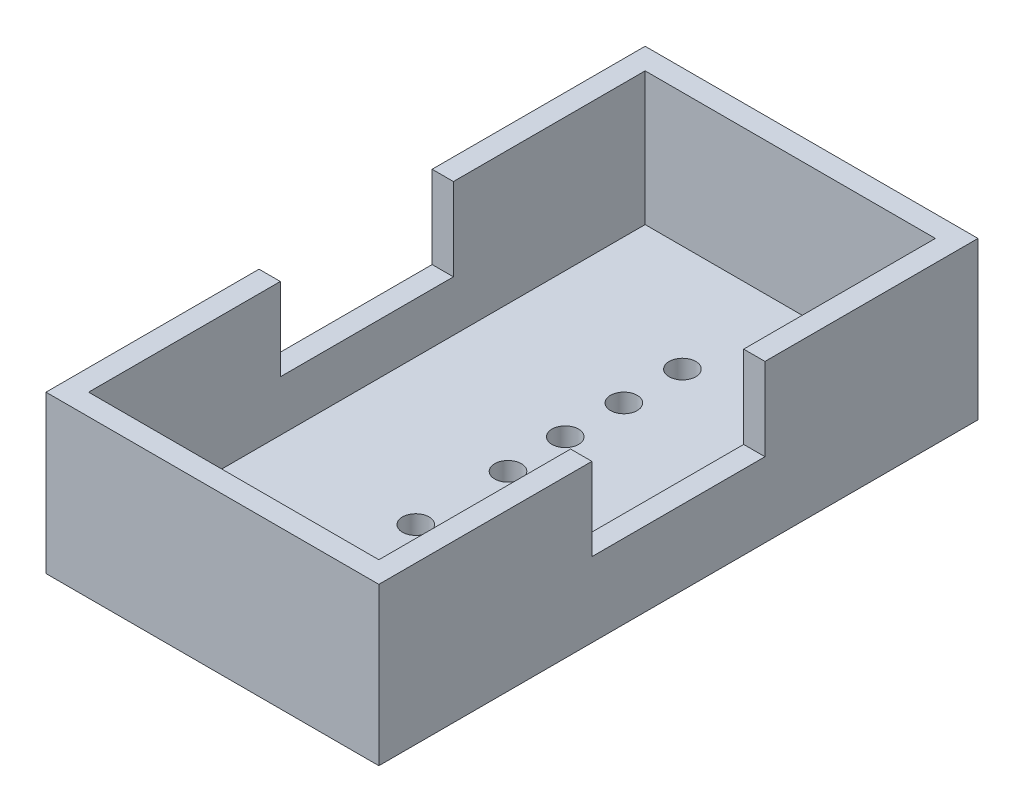
ISO-10303-21;
HEADER;
FILE_DESCRIPTION(('STEP AP214'),'2;1');
FILE_NAME('part.step','',(''),(''),'','','');
FILE_SCHEMA(('AUTOMOTIVE_DESIGN { 1 0 10303 214 1 1 1 1 }'));
ENDSEC;
DATA;
#1=APPLICATION_CONTEXT('core data for automotive mechanical design processes');
#2=APPLICATION_PROTOCOL_DEFINITION('international standard','automotive_design',2000,#1);
#3=PRODUCT_CONTEXT('',#1,'mechanical');
#4=PRODUCT('Part','Part','',(#3));
#5=PRODUCT_RELATED_PRODUCT_CATEGORY('part','',(#4));
#6=PRODUCT_DEFINITION_FORMATION('','',#4);
#7=PRODUCT_DEFINITION_CONTEXT('part definition',#1,'design');
#8=PRODUCT_DEFINITION('design','',#6,#7);
#9=PRODUCT_DEFINITION_SHAPE('','',#8);
#10=(LENGTH_UNIT() NAMED_UNIT(*) SI_UNIT(.MILLI.,.METRE.));
#11=(NAMED_UNIT(*) PLANE_ANGLE_UNIT() SI_UNIT($,.RADIAN.));
#12=(NAMED_UNIT(*) SI_UNIT($,.STERADIAN.) SOLID_ANGLE_UNIT());
#13=UNCERTAINTY_MEASURE_WITH_UNIT(LENGTH_MEASURE(1.E-05),#10,'distance_accuracy_value','');
#14=(GEOMETRIC_REPRESENTATION_CONTEXT(3) GLOBAL_UNCERTAINTY_ASSIGNED_CONTEXT((#13)) GLOBAL_UNIT_ASSIGNED_CONTEXT((#10,
#11,#12)) REPRESENTATION_CONTEXT('',''));
#15=CARTESIAN_POINT('',(0.,0.,0.));
#16=DIRECTION('',(0.,0.,1.));
#17=DIRECTION('',(1.,0.,0.));
#18=AXIS2_PLACEMENT_3D('',#15,#16,#17);
#19=CARTESIAN_POINT('',(0.,14.986,0.));
#20=DIRECTION('',(0.,-1.,0.));
#21=DIRECTION('',(0.,0.,-1.));
#22=AXIS2_PLACEMENT_3D('',#19,#20,#21);
#23=PLANE('',#22);
#24=DIRECTION('',(0.,0.,-1.));
#25=VECTOR('',#24,1.);
#26=CARTESIAN_POINT('',(15.875,14.986,-28.575));
#27=LINE('',#26,#25);
#28=CARTESIAN_POINT('',(15.875,14.986,28.575));
#29=VERTEX_POINT('',#28);
#30=CARTESIAN_POINT('',(15.875,14.986,8.25499999999999));
#31=VERTEX_POINT('',#30);
#32=EDGE_CURVE('E174',#29,#31,#27,.T.);
#33=ORIENTED_EDGE('',*,*,#32,.T.);
#34=DIRECTION('',(-1.,0.,0.));
#35=VECTOR('',#34,1.);
#36=CARTESIAN_POINT('',(15.875,14.986,8.25499999999999));
#37=LINE('',#36,#35);
#38=CARTESIAN_POINT('',(13.843,14.986,8.25499999999999));
#39=VERTEX_POINT('',#38);
#40=EDGE_CURVE('E156',#31,#39,#37,.T.);
#41=ORIENTED_EDGE('',*,*,#40,.T.);
#42=DIRECTION('',(0.,0.,-1.));
#43=VECTOR('',#42,1.);
#44=CARTESIAN_POINT('',(13.843,14.986,26.543));
#45=LINE('',#44,#43);
#46=CARTESIAN_POINT('',(13.843,14.986,26.543));
#47=VERTEX_POINT('',#46);
#48=EDGE_CURVE('E241',#47,#39,#45,.T.);
#49=ORIENTED_EDGE('',*,*,#48,.F.);
#50=DIRECTION('',(1.,0.,0.));
#51=VECTOR('',#50,1.);
#52=CARTESIAN_POINT('',(-13.843,14.986,26.543));
#53=LINE('',#52,#51);
#54=CARTESIAN_POINT('',(-13.843,14.986,26.543));
#55=VERTEX_POINT('',#54);
#56=EDGE_CURVE('E256',#55,#47,#53,.T.);
#57=ORIENTED_EDGE('',*,*,#56,.F.);
#58=DIRECTION('',(0.,0.,1.));
#59=VECTOR('',#58,1.);
#60=CARTESIAN_POINT('',(-13.843,14.986,-26.543));
#61=LINE('',#60,#59);
#62=CARTESIAN_POINT('',(-13.843,14.986,8.255));
#63=VERTEX_POINT('',#62);
#64=EDGE_CURVE('E371',#63,#55,#61,.T.);
#65=ORIENTED_EDGE('',*,*,#64,.F.);
#66=CARTESIAN_POINT('',(-15.875,14.986,8.255));
#67=VERTEX_POINT('',#66);
#68=EDGE_CURVE('E169',#63,#67,#37,.T.);
#69=ORIENTED_EDGE('',*,*,#68,.T.);
#70=DIRECTION('',(0.,0.,1.));
#71=VECTOR('',#70,1.);
#72=CARTESIAN_POINT('',(-15.875,14.986,28.575));
#73=LINE('',#72,#71);
#74=CARTESIAN_POINT('',(-15.875,14.986,28.575));
#75=VERTEX_POINT('',#74);
#76=EDGE_CURVE('E283',#67,#75,#73,.T.);
#77=ORIENTED_EDGE('',*,*,#76,.T.);
#78=DIRECTION('',(1.,0.,0.));
#79=VECTOR('',#78,1.);
#80=CARTESIAN_POINT('',(15.875,14.986,28.575));
#81=LINE('',#80,#79);
#82=EDGE_CURVE('E184',#75,#29,#81,.T.);
#83=ORIENTED_EDGE('',*,*,#82,.T.);
#84=EDGE_LOOP('',(#33,#41,#49,#57,#65,#69,#77,#83));
#85=FACE_BOUND('',#84,.T.);
#86=ADVANCED_FACE('F43',(#85),#23,.F.);
#87=CARTESIAN_POINT('',(15.875,2.286,-28.575));
#88=DIRECTION('',(-1.,0.,0.));
#89=DIRECTION('',(0.,0.,1.));
#90=AXIS2_PLACEMENT_3D('',#87,#88,#89);
#91=PLANE('',#90);
#92=DIRECTION('',(0.,0.,1.));
#93=VECTOR('',#92,1.);
#94=CARTESIAN_POINT('',(15.875,7.112,-8.25500000000001));
#95=LINE('',#94,#93);
#96=CARTESIAN_POINT('',(15.875,7.112,-8.25500000000001));
#97=VERTEX_POINT('',#96);
#98=CARTESIAN_POINT('',(15.875,7.112,8.255));
#99=VERTEX_POINT('',#98);
#100=EDGE_CURVE('E177',#97,#99,#95,.T.);
#101=ORIENTED_EDGE('',*,*,#100,.T.);
#102=DIRECTION('',(0.,1.,0.));
#103=VECTOR('',#102,1.);
#104=CARTESIAN_POINT('',(15.875,14.986,8.25499999999999));
#105=LINE('',#104,#103);
#106=EDGE_CURVE('E160',#99,#31,#105,.T.);
#107=ORIENTED_EDGE('',*,*,#106,.T.);
#108=ORIENTED_EDGE('',*,*,#32,.F.);
#109=DIRECTION('',(0.,-1.,0.));
#110=VECTOR('',#109,1.);
#111=CARTESIAN_POINT('',(15.875,2.286,28.575));
#112=LINE('',#111,#110);
#113=CARTESIAN_POINT('',(15.875,0.,28.575));
#114=VERTEX_POINT('',#113);
#115=EDGE_CURVE('E210',#29,#114,#112,.T.);
#116=ORIENTED_EDGE('',*,*,#115,.T.);
#117=DIRECTION('',(0.,0.,-1.));
#118=VECTOR('',#117,1.);
#119=CARTESIAN_POINT('',(15.875,0.,-28.575));
#120=LINE('',#119,#118);
#121=CARTESIAN_POINT('',(15.875,0.,-28.575));
#122=VERTEX_POINT('',#121);
#123=EDGE_CURVE('E193',#114,#122,#120,.T.);
#124=ORIENTED_EDGE('',*,*,#123,.T.);
#125=DIRECTION('',(0.,-1.,0.));
#126=VECTOR('',#125,1.);
#127=CARTESIAN_POINT('',(15.875,2.286,-28.575));
#128=LINE('',#127,#126);
#129=CARTESIAN_POINT('',(15.875,14.986,-28.575));
#130=VERTEX_POINT('',#129);
#131=EDGE_CURVE('E221',#130,#122,#128,.T.);
#132=ORIENTED_EDGE('',*,*,#131,.F.);
#133=CARTESIAN_POINT('',(15.875,14.986,-8.25500000000001));
#134=VERTEX_POINT('',#133);
#135=EDGE_CURVE('E187',#134,#130,#27,.T.);
#136=ORIENTED_EDGE('',*,*,#135,.F.);
#137=DIRECTION('',(0.,-1.,0.));
#138=VECTOR('',#137,1.);
#139=CARTESIAN_POINT('',(15.875,14.986,-8.25500000000001));
#140=LINE('',#139,#138);
#141=EDGE_CURVE('E179',#134,#97,#140,.T.);
#142=ORIENTED_EDGE('',*,*,#141,.T.);
#143=EDGE_LOOP('',(#101,#107,#108,#116,#124,#132,#136,#142));
#144=FACE_BOUND('',#143,.T.);
#145=ADVANCED_FACE('F45',(#144),#91,.F.);
#146=CARTESIAN_POINT('',(-15.875,2.286,-28.575));
#147=DIRECTION('',(0.,0.,1.));
#148=DIRECTION('',(1.,0.,0.));
#149=AXIS2_PLACEMENT_3D('',#146,#147,#148);
#150=PLANE('',#149);
#151=DIRECTION('',(-1.,0.,0.));
#152=VECTOR('',#151,1.);
#153=CARTESIAN_POINT('',(-15.875,0.,-28.575));
#154=LINE('',#153,#152);
#155=CARTESIAN_POINT('',(-15.875,0.,-28.575));
#156=VERTEX_POINT('',#155);
#157=EDGE_CURVE('E201',#122,#156,#154,.T.);
#158=ORIENTED_EDGE('',*,*,#157,.T.);
#159=DIRECTION('',(0.,-1.,0.));
#160=VECTOR('',#159,1.);
#161=CARTESIAN_POINT('',(-15.875,2.286,-28.575));
#162=LINE('',#161,#160);
#163=CARTESIAN_POINT('',(-15.875,14.986,-28.575));
#164=VERTEX_POINT('',#163);
#165=EDGE_CURVE('E217',#164,#156,#162,.T.);
#166=ORIENTED_EDGE('',*,*,#165,.F.);
#167=DIRECTION('',(-1.,0.,0.));
#168=VECTOR('',#167,1.);
#169=CARTESIAN_POINT('',(-15.875,14.986,-28.575));
#170=LINE('',#169,#168);
#171=EDGE_CURVE('E186',#130,#164,#170,.T.);
#172=ORIENTED_EDGE('',*,*,#171,.F.);
#173=ORIENTED_EDGE('',*,*,#131,.T.);
#174=EDGE_LOOP('',(#158,#166,#172,#173));
#175=FACE_BOUND('',#174,.T.);
#176=ADVANCED_FACE('F311',(#175),#150,.F.);
#177=CARTESIAN_POINT('',(-15.875,2.286,-28.575));
#178=DIRECTION('',(1.,0.,0.));
#179=DIRECTION('',(0.,0.,-1.));
#180=AXIS2_PLACEMENT_3D('',#177,#178,#179);
#181=PLANE('',#180);
#182=ORIENTED_EDGE('',*,*,#76,.F.);
#183=DIRECTION('',(0.,1.,0.));
#184=VECTOR('',#183,1.);
#185=CARTESIAN_POINT('',(-15.875,14.986,8.255));
#186=LINE('',#185,#184);
#187=CARTESIAN_POINT('',(-15.875,7.112,8.255));
#188=VERTEX_POINT('',#187);
#189=EDGE_CURVE('E403',#188,#67,#186,.T.);
#190=ORIENTED_EDGE('',*,*,#189,.F.);
#191=DIRECTION('',(0.,0.,1.));
#192=VECTOR('',#191,1.);
#193=CARTESIAN_POINT('',(-15.875,7.112,-8.255));
#194=LINE('',#193,#192);
#195=CARTESIAN_POINT('',(-15.875,7.112,-8.255));
#196=VERTEX_POINT('',#195);
#197=EDGE_CURVE('E180',#196,#188,#194,.T.);
#198=ORIENTED_EDGE('',*,*,#197,.F.);
#199=DIRECTION('',(0.,-1.,0.));
#200=VECTOR('',#199,1.);
#201=CARTESIAN_POINT('',(-15.875,14.986,-8.255));
#202=LINE('',#201,#200);
#203=CARTESIAN_POINT('',(-15.875,14.986,-8.255));
#204=VERTEX_POINT('',#203);
#205=EDGE_CURVE('E399',#204,#196,#202,.T.);
#206=ORIENTED_EDGE('',*,*,#205,.F.);
#207=EDGE_CURVE('E284',#164,#204,#73,.T.);
#208=ORIENTED_EDGE('',*,*,#207,.F.);
#209=ORIENTED_EDGE('',*,*,#165,.T.);
#210=DIRECTION('',(0.,0.,1.));
#211=VECTOR('',#210,1.);
#212=CARTESIAN_POINT('',(-15.875,0.,-28.575));
#213=LINE('',#212,#211);
#214=CARTESIAN_POINT('',(-15.875,0.,28.575));
#215=VERTEX_POINT('',#214);
#216=EDGE_CURVE('E204',#156,#215,#213,.T.);
#217=ORIENTED_EDGE('',*,*,#216,.T.);
#218=DIRECTION('',(0.,-1.,0.));
#219=VECTOR('',#218,1.);
#220=CARTESIAN_POINT('',(-15.875,2.286,28.575));
#221=LINE('',#220,#219);
#222=EDGE_CURVE('E213',#75,#215,#221,.T.);
#223=ORIENTED_EDGE('',*,*,#222,.F.);
#224=EDGE_LOOP('',(#182,#190,#198,#206,#208,#209,#217,#223));
#225=FACE_BOUND('',#224,.T.);
#226=ADVANCED_FACE('F300',(#225),#181,.F.);
#227=CARTESIAN_POINT('',(-15.875,2.286,28.575));
#228=DIRECTION('',(0.,0.,-1.));
#229=DIRECTION('',(-1.,0.,0.));
#230=AXIS2_PLACEMENT_3D('',#227,#228,#229);
#231=PLANE('',#230);
#232=DIRECTION('',(1.,0.,0.));
#233=VECTOR('',#232,1.);
#234=CARTESIAN_POINT('',(-15.875,0.,28.575));
#235=LINE('',#234,#233);
#236=EDGE_CURVE('E207',#215,#114,#235,.T.);
#237=ORIENTED_EDGE('',*,*,#236,.T.);
#238=ORIENTED_EDGE('',*,*,#115,.F.);
#239=ORIENTED_EDGE('',*,*,#82,.F.);
#240=ORIENTED_EDGE('',*,*,#222,.T.);
#241=EDGE_LOOP('',(#237,#238,#239,#240));
#242=FACE_BOUND('',#241,.T.);
#243=ADVANCED_FACE('F304',(#242),#231,.F.);
#244=CARTESIAN_POINT('',(0.,0.,0.));
#245=DIRECTION('',(0.,1.,0.));
#246=DIRECTION('',(0.,0.,1.));
#247=AXIS2_PLACEMENT_3D('',#244,#245,#246);
#248=PLANE('',#247);
#249=CARTESIAN_POINT('',(-0.127,0.,-16.383));
#250=DIRECTION('',(0.,1.,0.));
#251=DIRECTION('',(0.,0.,1.));
#252=AXIS2_PLACEMENT_3D('',#249,#250,#251);
#253=CIRCLE('',#252,1.27);
#254=CARTESIAN_POINT('',(-0.127,0.,-15.113));
#255=VERTEX_POINT('',#254);
#256=EDGE_CURVE('E264',#255,#255,#253,.T.);
#257=ORIENTED_EDGE('',*,*,#256,.T.);
#258=EDGE_LOOP('',(#257));
#259=FACE_BOUND('',#258,.T.);
#260=CARTESIAN_POINT('',(-0.127,0.,-10.795));
#261=DIRECTION('',(0.,1.,0.));
#262=DIRECTION('',(0.,0.,1.));
#263=AXIS2_PLACEMENT_3D('',#260,#261,#262);
#264=CIRCLE('',#263,1.27);
#265=CARTESIAN_POINT('',(-0.127,0.,-9.525));
#266=VERTEX_POINT('',#265);
#267=EDGE_CURVE('E343',#266,#266,#264,.T.);
#268=ORIENTED_EDGE('',*,*,#267,.T.);
#269=EDGE_LOOP('',(#268));
#270=FACE_BOUND('',#269,.T.);
#271=CARTESIAN_POINT('',(-0.127,0.,-5.207));
#272=DIRECTION('',(0.,1.,0.));
#273=DIRECTION('',(0.,0.,1.));
#274=AXIS2_PLACEMENT_3D('',#271,#272,#273);
#275=CIRCLE('',#274,1.27);
#276=CARTESIAN_POINT('',(-0.127,0.,-3.937));
#277=VERTEX_POINT('',#276);
#278=EDGE_CURVE('E351',#277,#277,#275,.T.);
#279=ORIENTED_EDGE('',*,*,#278,.T.);
#280=EDGE_LOOP('',(#279));
#281=FACE_BOUND('',#280,.T.);
#282=CARTESIAN_POINT('',(0.,0.,0.380999999999998));
#283=DIRECTION('',(0.,1.,0.));
#284=DIRECTION('',(0.,0.,1.));
#285=AXIS2_PLACEMENT_3D('',#282,#283,#284);
#286=CIRCLE('',#285,1.27);
#287=CARTESIAN_POINT('',(0.,0.,1.651));
#288=VERTEX_POINT('',#287);
#289=EDGE_CURVE('E359',#288,#288,#286,.T.);
#290=ORIENTED_EDGE('',*,*,#289,.T.);
#291=EDGE_LOOP('',(#290));
#292=FACE_BOUND('',#291,.T.);
#293=CARTESIAN_POINT('',(0.,0.,9.17698069543824));
#294=DIRECTION('',(0.,1.,0.));
#295=DIRECTION('',(0.,0.,1.));
#296=AXIS2_PLACEMENT_3D('',#293,#294,#295);
#297=CIRCLE('',#296,1.27);
#298=CARTESIAN_POINT('',(0.,0.,10.4469806954382));
#299=VERTEX_POINT('',#298);
#300=EDGE_CURVE('E331',#299,#299,#297,.T.);
#301=ORIENTED_EDGE('',*,*,#300,.T.);
#302=EDGE_LOOP('',(#301));
#303=FACE_BOUND('',#302,.T.);
#304=ORIENTED_EDGE('',*,*,#123,.F.);
#305=ORIENTED_EDGE('',*,*,#236,.F.);
#306=ORIENTED_EDGE('',*,*,#216,.F.);
#307=ORIENTED_EDGE('',*,*,#157,.F.);
#308=EDGE_LOOP('',(#304,#305,#306,#307));
#309=FACE_BOUND('',#308,.T.);
#310=ADVANCED_FACE('F308',(#259,#270,#281,#292,#303,#309),#248,.F.);
#311=ORIENTED_EDGE('',*,*,#207,.T.);
#312=DIRECTION('',(-1.,0.,0.));
#313=VECTOR('',#312,1.);
#314=CARTESIAN_POINT('',(15.875,14.986,-8.25500000000001));
#315=LINE('',#314,#313);
#316=CARTESIAN_POINT('',(-13.843,14.986,-8.255));
#317=VERTEX_POINT('',#316);
#318=EDGE_CURVE('E168',#317,#204,#315,.T.);
#319=ORIENTED_EDGE('',*,*,#318,.F.);
#320=CARTESIAN_POINT('',(-13.843,14.986,-26.543));
#321=VERTEX_POINT('',#320);
#322=EDGE_CURVE('E372',#321,#317,#61,.T.);
#323=ORIENTED_EDGE('',*,*,#322,.F.);
#324=DIRECTION('',(-1.,0.,0.));
#325=VECTOR('',#324,1.);
#326=CARTESIAN_POINT('',(13.843,14.986,-26.543));
#327=LINE('',#326,#325);
#328=CARTESIAN_POINT('',(13.843,14.986,-26.543));
#329=VERTEX_POINT('',#328);
#330=EDGE_CURVE('E272',#329,#321,#327,.T.);
#331=ORIENTED_EDGE('',*,*,#330,.F.);
#332=CARTESIAN_POINT('',(13.843,14.986,-8.25500000000001));
#333=VERTEX_POINT('',#332);
#334=EDGE_CURVE('E249',#333,#329,#45,.T.);
#335=ORIENTED_EDGE('',*,*,#334,.F.);
#336=EDGE_CURVE('E67',#134,#333,#315,.T.);
#337=ORIENTED_EDGE('',*,*,#336,.F.);
#338=ORIENTED_EDGE('',*,*,#135,.T.);
#339=ORIENTED_EDGE('',*,*,#171,.T.);
#340=EDGE_LOOP('',(#311,#319,#323,#331,#335,#337,#338,#339));
#341=FACE_BOUND('',#340,.T.);
#342=ADVANCED_FACE('F313',(#341),#23,.F.);
#343=CARTESIAN_POINT('',(13.843,14.986,-26.543));
#344=DIRECTION('',(0.,0.,1.));
#345=DIRECTION('',(1.,0.,0.));
#346=AXIS2_PLACEMENT_3D('',#343,#344,#345);
#347=PLANE('',#346);
#348=DIRECTION('',(-1.,0.,0.));
#349=VECTOR('',#348,1.);
#350=CARTESIAN_POINT('',(13.843,2.286,-26.543));
#351=LINE('',#350,#349);
#352=CARTESIAN_POINT('',(13.843,2.286,-26.543));
#353=VERTEX_POINT('',#352);
#354=CARTESIAN_POINT('',(-13.843,2.286,-26.543));
#355=VERTEX_POINT('',#354);
#356=EDGE_CURVE('E260',#353,#355,#351,.T.);
#357=ORIENTED_EDGE('',*,*,#356,.F.);
#358=DIRECTION('',(0.,-1.,0.));
#359=VECTOR('',#358,1.);
#360=CARTESIAN_POINT('',(13.843,14.986,-26.543));
#361=LINE('',#360,#359);
#362=EDGE_CURVE('E248',#329,#353,#361,.T.);
#363=ORIENTED_EDGE('',*,*,#362,.F.);
#364=ORIENTED_EDGE('',*,*,#330,.T.);
#365=DIRECTION('',(0.,-1.,0.));
#366=VECTOR('',#365,1.);
#367=CARTESIAN_POINT('',(-13.843,14.986,-26.543));
#368=LINE('',#367,#366);
#369=EDGE_CURVE('E280',#321,#355,#368,.T.);
#370=ORIENTED_EDGE('',*,*,#369,.T.);
#371=EDGE_LOOP('',(#357,#363,#364,#370));
#372=FACE_BOUND('',#371,.T.);
#373=ADVANCED_FACE('F395',(#372),#347,.T.);
#374=CARTESIAN_POINT('',(-13.843,14.986,-26.543));
#375=DIRECTION('',(1.,0.,0.));
#376=DIRECTION('',(0.,0.,-1.));
#377=AXIS2_PLACEMENT_3D('',#374,#375,#376);
#378=PLANE('',#377);
#379=DIRECTION('',(0.,-1.,0.));
#380=VECTOR('',#379,1.);
#381=CARTESIAN_POINT('',(-13.843,14.986,8.255));
#382=LINE('',#381,#380);
#383=CARTESIAN_POINT('',(-13.843,7.112,8.255));
#384=VERTEX_POINT('',#383);
#385=EDGE_CURVE('E328',#63,#384,#382,.T.);
#386=ORIENTED_EDGE('',*,*,#385,.F.);
#387=ORIENTED_EDGE('',*,*,#64,.T.);
#388=DIRECTION('',(0.,-1.,0.));
#389=VECTOR('',#388,1.);
#390=CARTESIAN_POINT('',(-13.843,14.986,26.543));
#391=LINE('',#390,#389);
#392=CARTESIAN_POINT('',(-13.843,2.286,26.543));
#393=VERTEX_POINT('',#392);
#394=EDGE_CURVE('E276',#55,#393,#391,.T.);
#395=ORIENTED_EDGE('',*,*,#394,.T.);
#396=DIRECTION('',(0.,0.,1.));
#397=VECTOR('',#396,1.);
#398=CARTESIAN_POINT('',(-13.843,2.286,-26.543));
#399=LINE('',#398,#397);
#400=EDGE_CURVE('E263',#355,#393,#399,.T.);
#401=ORIENTED_EDGE('',*,*,#400,.F.);
#402=ORIENTED_EDGE('',*,*,#369,.F.);
#403=ORIENTED_EDGE('',*,*,#322,.T.);
#404=DIRECTION('',(0.,1.,0.));
#405=VECTOR('',#404,1.);
#406=CARTESIAN_POINT('',(-13.843,14.986,-8.25500000000001));
#407=LINE('',#406,#405);
#408=CARTESIAN_POINT('',(-13.843,7.112,-8.255));
#409=VERTEX_POINT('',#408);
#410=EDGE_CURVE('E237',#409,#317,#407,.T.);
#411=ORIENTED_EDGE('',*,*,#410,.F.);
#412=DIRECTION('',(0.,0.,-1.));
#413=VECTOR('',#412,1.);
#414=CARTESIAN_POINT('',(-13.843,7.112,-26.543));
#415=LINE('',#414,#413);
#416=EDGE_CURVE('E325',#384,#409,#415,.T.);
#417=ORIENTED_EDGE('',*,*,#416,.F.);
#418=EDGE_LOOP('',(#386,#387,#395,#401,#402,#403,#411,#417));
#419=FACE_BOUND('',#418,.T.);
#420=ADVANCED_FACE('F385',(#419),#378,.T.);
#421=CARTESIAN_POINT('',(-13.843,14.986,26.543));
#422=DIRECTION('',(0.,0.,-1.));
#423=DIRECTION('',(-1.,0.,0.));
#424=AXIS2_PLACEMENT_3D('',#421,#422,#423);
#425=PLANE('',#424);
#426=DIRECTION('',(1.,0.,0.));
#427=VECTOR('',#426,1.);
#428=CARTESIAN_POINT('',(-13.843,2.286,26.543));
#429=LINE('',#428,#427);
#430=CARTESIAN_POINT('',(13.843,2.286,26.543));
#431=VERTEX_POINT('',#430);
#432=EDGE_CURVE('E267',#393,#431,#429,.T.);
#433=ORIENTED_EDGE('',*,*,#432,.F.);
#434=ORIENTED_EDGE('',*,*,#394,.F.);
#435=ORIENTED_EDGE('',*,*,#56,.T.);
#436=DIRECTION('',(0.,-1.,0.));
#437=VECTOR('',#436,1.);
#438=CARTESIAN_POINT('',(13.843,14.986,26.543));
#439=LINE('',#438,#437);
#440=EDGE_CURVE('E244',#47,#431,#439,.T.);
#441=ORIENTED_EDGE('',*,*,#440,.T.);
#442=EDGE_LOOP('',(#433,#434,#435,#441));
#443=FACE_BOUND('',#442,.T.);
#444=ADVANCED_FACE('F390',(#443),#425,.T.);
#445=CARTESIAN_POINT('',(13.843,14.986,26.543));
#446=DIRECTION('',(-1.,0.,0.));
#447=DIRECTION('',(0.,0.,1.));
#448=AXIS2_PLACEMENT_3D('',#445,#446,#447);
#449=PLANE('',#448);
#450=DIRECTION('',(0.,1.,0.));
#451=VECTOR('',#450,1.);
#452=CARTESIAN_POINT('',(13.843,14.986,8.255));
#453=LINE('',#452,#451);
#454=CARTESIAN_POINT('',(13.843,7.112,8.255));
#455=VERTEX_POINT('',#454);
#456=EDGE_CURVE('E11',#455,#39,#453,.T.);
#457=ORIENTED_EDGE('',*,*,#456,.F.);
#458=DIRECTION('',(0.,0.,1.));
#459=VECTOR('',#458,1.);
#460=CARTESIAN_POINT('',(13.843,7.112,26.543));
#461=LINE('',#460,#459);
#462=CARTESIAN_POINT('',(13.843,7.112,-8.25500000000001));
#463=VERTEX_POINT('',#462);
#464=EDGE_CURVE('E52',#463,#455,#461,.T.);
#465=ORIENTED_EDGE('',*,*,#464,.F.);
#466=DIRECTION('',(0.,-1.,0.));
#467=VECTOR('',#466,1.);
#468=CARTESIAN_POINT('',(13.843,14.986,-8.25500000000001));
#469=LINE('',#468,#467);
#470=EDGE_CURVE('E225',#333,#463,#469,.T.);
#471=ORIENTED_EDGE('',*,*,#470,.F.);
#472=ORIENTED_EDGE('',*,*,#334,.T.);
#473=ORIENTED_EDGE('',*,*,#362,.T.);
#474=DIRECTION('',(0.,0.,-1.));
#475=VECTOR('',#474,1.);
#476=CARTESIAN_POINT('',(13.843,2.286,26.543));
#477=LINE('',#476,#475);
#478=EDGE_CURVE('E270',#431,#353,#477,.T.);
#479=ORIENTED_EDGE('',*,*,#478,.F.);
#480=ORIENTED_EDGE('',*,*,#440,.F.);
#481=ORIENTED_EDGE('',*,*,#48,.T.);
#482=EDGE_LOOP('',(#457,#465,#471,#472,#473,#479,#480,#481));
#483=FACE_BOUND('',#482,.T.);
#484=ADVANCED_FACE('F240',(#483),#449,.T.);
#485=CARTESIAN_POINT('',(0.,2.286,0.));
#486=DIRECTION('',(0.,1.,0.));
#487=DIRECTION('',(0.,0.,1.));
#488=AXIS2_PLACEMENT_3D('',#485,#486,#487);
#489=PLANE('',#488);
#490=CARTESIAN_POINT('',(-0.127,2.286,-16.383));
#491=DIRECTION('',(0.,1.,0.));
#492=DIRECTION('',(0.,0.,1.));
#493=AXIS2_PLACEMENT_3D('',#490,#491,#492);
#494=CIRCLE('',#493,1.27);
#495=CARTESIAN_POINT('',(-0.127,2.286,-15.113));
#496=VERTEX_POINT('',#495);
#497=EDGE_CURVE('E335',#496,#496,#494,.T.);
#498=ORIENTED_EDGE('',*,*,#497,.F.);
#499=EDGE_LOOP('',(#498));
#500=FACE_BOUND('',#499,.T.);
#501=CARTESIAN_POINT('',(-0.127,2.286,-10.795));
#502=DIRECTION('',(0.,1.,0.));
#503=DIRECTION('',(0.,0.,1.));
#504=AXIS2_PLACEMENT_3D('',#501,#502,#503);
#505=CIRCLE('',#504,1.27);
#506=CARTESIAN_POINT('',(-0.127,2.286,-9.525));
#507=VERTEX_POINT('',#506);
#508=EDGE_CURVE('E339',#507,#507,#505,.T.);
#509=ORIENTED_EDGE('',*,*,#508,.F.);
#510=EDGE_LOOP('',(#509));
#511=FACE_BOUND('',#510,.T.);
#512=CARTESIAN_POINT('',(-0.127,2.286,-5.207));
#513=DIRECTION('',(0.,1.,0.));
#514=DIRECTION('',(0.,0.,1.));
#515=AXIS2_PLACEMENT_3D('',#512,#513,#514);
#516=CIRCLE('',#515,1.27);
#517=CARTESIAN_POINT('',(-0.127,2.286,-3.937));
#518=VERTEX_POINT('',#517);
#519=EDGE_CURVE('E347',#518,#518,#516,.T.);
#520=ORIENTED_EDGE('',*,*,#519,.F.);
#521=EDGE_LOOP('',(#520));
#522=FACE_BOUND('',#521,.T.);
#523=CARTESIAN_POINT('',(0.,2.286,0.380999999999998));
#524=DIRECTION('',(0.,1.,0.));
#525=DIRECTION('',(0.,0.,1.));
#526=AXIS2_PLACEMENT_3D('',#523,#524,#525);
#527=CIRCLE('',#526,1.27);
#528=CARTESIAN_POINT('',(0.,2.286,1.651));
#529=VERTEX_POINT('',#528);
#530=EDGE_CURVE('E355',#529,#529,#527,.T.);
#531=ORIENTED_EDGE('',*,*,#530,.F.);
#532=EDGE_LOOP('',(#531));
#533=FACE_BOUND('',#532,.T.);
#534=CARTESIAN_POINT('',(0.,2.286,9.17698069543824));
#535=DIRECTION('',(0.,1.,0.));
#536=DIRECTION('',(0.,0.,1.));
#537=AXIS2_PLACEMENT_3D('',#534,#535,#536);
#538=CIRCLE('',#537,1.27);
#539=CARTESIAN_POINT('',(0.,2.286,10.4469806954382));
#540=VERTEX_POINT('',#539);
#541=EDGE_CURVE('E363',#540,#540,#538,.T.);
#542=ORIENTED_EDGE('',*,*,#541,.F.);
#543=EDGE_LOOP('',(#542));
#544=FACE_BOUND('',#543,.T.);
#545=ORIENTED_EDGE('',*,*,#356,.T.);
#546=ORIENTED_EDGE('',*,*,#400,.T.);
#547=ORIENTED_EDGE('',*,*,#432,.T.);
#548=ORIENTED_EDGE('',*,*,#478,.T.);
#549=EDGE_LOOP('',(#545,#546,#547,#548));
#550=FACE_BOUND('',#549,.T.);
#551=ADVANCED_FACE('F392',(#500,#511,#522,#533,#544,#550),#489,.T.);
#552=CARTESIAN_POINT('',(0.,0.,9.17698069543824));
#553=DIRECTION('',(0.,1.,0.));
#554=DIRECTION('',(0.,0.,1.));
#555=AXIS2_PLACEMENT_3D('',#552,#553,#554);
#556=CYLINDRICAL_SURFACE('',#555,1.27);
#557=ORIENTED_EDGE('',*,*,#300,.F.);
#558=EDGE_LOOP('',(#557));
#559=FACE_BOUND('',#558,.T.);
#560=ORIENTED_EDGE('',*,*,#541,.T.);
#561=EDGE_LOOP('',(#560));
#562=FACE_BOUND('',#561,.T.);
#563=ADVANCED_FACE('F520',(#559,#562),#556,.F.);
#564=CARTESIAN_POINT('',(0.,0.,0.380999999999998));
#565=DIRECTION('',(0.,1.,0.));
#566=DIRECTION('',(0.,0.,1.));
#567=AXIS2_PLACEMENT_3D('',#564,#565,#566);
#568=CYLINDRICAL_SURFACE('',#567,1.27);
#569=ORIENTED_EDGE('',*,*,#289,.F.);
#570=EDGE_LOOP('',(#569));
#571=FACE_BOUND('',#570,.T.);
#572=ORIENTED_EDGE('',*,*,#530,.T.);
#573=EDGE_LOOP('',(#572));
#574=FACE_BOUND('',#573,.T.);
#575=ADVANCED_FACE('F525',(#571,#574),#568,.F.);
#576=CARTESIAN_POINT('',(-0.127,0.,-5.207));
#577=DIRECTION('',(0.,1.,0.));
#578=DIRECTION('',(0.,0.,1.));
#579=AXIS2_PLACEMENT_3D('',#576,#577,#578);
#580=CYLINDRICAL_SURFACE('',#579,1.27);
#581=ORIENTED_EDGE('',*,*,#278,.F.);
#582=EDGE_LOOP('',(#581));
#583=FACE_BOUND('',#582,.T.);
#584=ORIENTED_EDGE('',*,*,#519,.T.);
#585=EDGE_LOOP('',(#584));
#586=FACE_BOUND('',#585,.T.);
#587=ADVANCED_FACE('F535',(#583,#586),#580,.F.);
#588=CARTESIAN_POINT('',(-0.127,0.,-10.795));
#589=DIRECTION('',(0.,1.,0.));
#590=DIRECTION('',(0.,0.,1.));
#591=AXIS2_PLACEMENT_3D('',#588,#589,#590);
#592=CYLINDRICAL_SURFACE('',#591,1.27);
#593=ORIENTED_EDGE('',*,*,#267,.F.);
#594=EDGE_LOOP('',(#593));
#595=FACE_BOUND('',#594,.T.);
#596=ORIENTED_EDGE('',*,*,#508,.T.);
#597=EDGE_LOOP('',(#596));
#598=FACE_BOUND('',#597,.T.);
#599=ADVANCED_FACE('F545',(#595,#598),#592,.F.);
#600=CARTESIAN_POINT('',(-0.127,0.,-16.383));
#601=DIRECTION('',(0.,1.,0.));
#602=DIRECTION('',(0.,0.,1.));
#603=AXIS2_PLACEMENT_3D('',#600,#601,#602);
#604=CYLINDRICAL_SURFACE('',#603,1.27);
#605=ORIENTED_EDGE('',*,*,#256,.F.);
#606=EDGE_LOOP('',(#605));
#607=FACE_BOUND('',#606,.T.);
#608=ORIENTED_EDGE('',*,*,#497,.T.);
#609=EDGE_LOOP('',(#608));
#610=FACE_BOUND('',#609,.T.);
#611=ADVANCED_FACE('F555',(#607,#610),#604,.F.);
#612=CARTESIAN_POINT('',(15.875,14.986,-8.25500000000001));
#613=DIRECTION('',(0.,0.,-1.));
#614=DIRECTION('',(0.,1.,0.));
#615=AXIS2_PLACEMENT_3D('',#612,#613,#614);
#616=PLANE('',#615);
#617=ORIENTED_EDGE('',*,*,#470,.T.);
#618=DIRECTION('',(-1.,0.,0.));
#619=VECTOR('',#618,1.);
#620=CARTESIAN_POINT('',(15.875,7.112,-8.25500000000001));
#621=LINE('',#620,#619);
#622=EDGE_CURVE('E234',#97,#463,#621,.T.);
#623=ORIENTED_EDGE('',*,*,#622,.F.);
#624=ORIENTED_EDGE('',*,*,#141,.F.);
#625=ORIENTED_EDGE('',*,*,#336,.T.);
#626=EDGE_LOOP('',(#617,#623,#624,#625));
#627=FACE_BOUND('',#626,.T.);
#628=ADVANCED_FACE('F436',(#627),#616,.F.);
#629=CARTESIAN_POINT('',(15.875,7.112,-8.25500000000001));
#630=DIRECTION('',(0.,-1.,0.));
#631=DIRECTION('',(0.,0.,-1.));
#632=AXIS2_PLACEMENT_3D('',#629,#630,#631);
#633=PLANE('',#632);
#634=ORIENTED_EDGE('',*,*,#464,.T.);
#635=DIRECTION('',(-1.,0.,0.));
#636=VECTOR('',#635,1.);
#637=CARTESIAN_POINT('',(15.875,7.112,8.255));
#638=LINE('',#637,#636);
#639=EDGE_CURVE('E233',#99,#455,#638,.T.);
#640=ORIENTED_EDGE('',*,*,#639,.F.);
#641=ORIENTED_EDGE('',*,*,#100,.F.);
#642=ORIENTED_EDGE('',*,*,#622,.T.);
#643=EDGE_LOOP('',(#634,#640,#641,#642));
#644=FACE_BOUND('',#643,.T.);
#645=ADVANCED_FACE('F232',(#644),#633,.F.);
#646=CARTESIAN_POINT('',(15.875,14.986,8.25499999999999));
#647=DIRECTION('',(0.,0.,1.));
#648=DIRECTION('',(0.,-1.,0.));
#649=AXIS2_PLACEMENT_3D('',#646,#647,#648);
#650=PLANE('',#649);
#651=ORIENTED_EDGE('',*,*,#456,.T.);
#652=ORIENTED_EDGE('',*,*,#40,.F.);
#653=ORIENTED_EDGE('',*,*,#106,.F.);
#654=ORIENTED_EDGE('',*,*,#639,.T.);
#655=EDGE_LOOP('',(#651,#652,#653,#654));
#656=FACE_BOUND('',#655,.T.);
#657=ADVANCED_FACE('F158',(#656),#650,.F.);
#658=ORIENTED_EDGE('',*,*,#385,.T.);
#659=EDGE_CURVE('E238',#384,#188,#638,.T.);
#660=ORIENTED_EDGE('',*,*,#659,.T.);
#661=ORIENTED_EDGE('',*,*,#189,.T.);
#662=ORIENTED_EDGE('',*,*,#68,.F.);
#663=EDGE_LOOP('',(#658,#660,#661,#662));
#664=FACE_BOUND('',#663,.T.);
#665=ADVANCED_FACE('F424',(#664),#650,.F.);
#666=ORIENTED_EDGE('',*,*,#416,.T.);
#667=EDGE_CURVE('E59',#409,#196,#621,.T.);
#668=ORIENTED_EDGE('',*,*,#667,.T.);
#669=ORIENTED_EDGE('',*,*,#197,.T.);
#670=ORIENTED_EDGE('',*,*,#659,.F.);
#671=EDGE_LOOP('',(#666,#668,#669,#670));
#672=FACE_BOUND('',#671,.T.);
#673=ADVANCED_FACE('F428',(#672),#633,.F.);
#674=ORIENTED_EDGE('',*,*,#410,.T.);
#675=ORIENTED_EDGE('',*,*,#318,.T.);
#676=ORIENTED_EDGE('',*,*,#205,.T.);
#677=ORIENTED_EDGE('',*,*,#667,.F.);
#678=EDGE_LOOP('',(#674,#675,#676,#677));
#679=FACE_BOUND('',#678,.T.);
#680=ADVANCED_FACE('F398',(#679),#616,.F.);
#681=CLOSED_SHELL('',(#86,#145,#176,#226,#243,#310,#342,#373,#420,#444,#484,#551,#563,#575,#587,
#599,#611,#628,#645,#657,#665,#673,#680));
#682=MANIFOLD_SOLID_BREP('B2',#681);
#683=ADVANCED_BREP_SHAPE_REPRESENTATION('',(#18,#682),#14);
#684=SHAPE_DEFINITION_REPRESENTATION(#9,#683);
ENDSEC;
END-ISO-10303-21;
